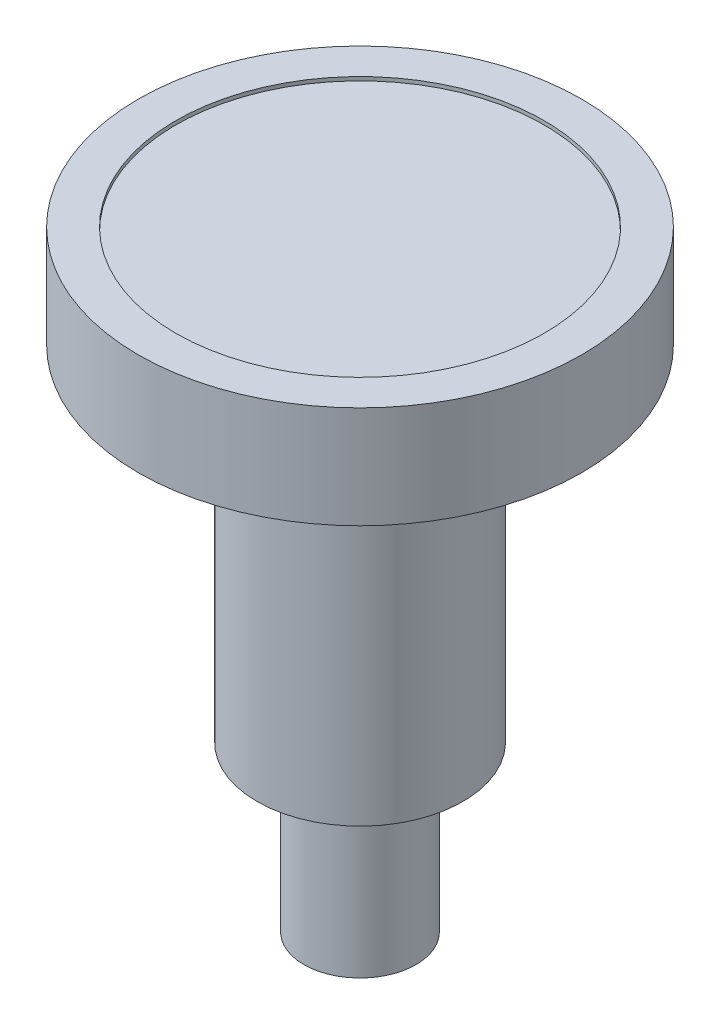
ISO-10303-21;
HEADER;
FILE_DESCRIPTION(('STEP AP214'),'2;1');
FILE_NAME('part.step','',(''),(''),'','','');
FILE_SCHEMA(('AUTOMOTIVE_DESIGN { 1 0 10303 214 1 1 1 1 }'));
ENDSEC;
DATA;
#1=APPLICATION_CONTEXT('core data for automotive mechanical design processes');
#2=APPLICATION_PROTOCOL_DEFINITION('international standard','automotive_design',2000,#1);
#3=PRODUCT_CONTEXT('',#1,'mechanical');
#4=PRODUCT('Part','Part','',(#3));
#5=PRODUCT_RELATED_PRODUCT_CATEGORY('part','',(#4));
#6=PRODUCT_DEFINITION_FORMATION('','',#4);
#7=PRODUCT_DEFINITION_CONTEXT('part definition',#1,'design');
#8=PRODUCT_DEFINITION('design','',#6,#7);
#9=PRODUCT_DEFINITION_SHAPE('','',#8);
#10=(LENGTH_UNIT() NAMED_UNIT(*) SI_UNIT(.MILLI.,.METRE.));
#11=(NAMED_UNIT(*) PLANE_ANGLE_UNIT() SI_UNIT($,.RADIAN.));
#12=(NAMED_UNIT(*) SI_UNIT($,.STERADIAN.) SOLID_ANGLE_UNIT());
#13=UNCERTAINTY_MEASURE_WITH_UNIT(LENGTH_MEASURE(1.E-05),#10,'distance_accuracy_value','');
#14=(GEOMETRIC_REPRESENTATION_CONTEXT(3) GLOBAL_UNCERTAINTY_ASSIGNED_CONTEXT((#13)) GLOBAL_UNIT_ASSIGNED_CONTEXT((#10,
#11,#12)) REPRESENTATION_CONTEXT('',''));
#15=CARTESIAN_POINT('',(0.,0.,0.));
#16=DIRECTION('',(0.,0.,1.));
#17=DIRECTION('',(1.,0.,0.));
#18=AXIS2_PLACEMENT_3D('',#15,#16,#17);
#19=CARTESIAN_POINT('',(0.,4.4,0.));
#20=DIRECTION('',(0.,-1.,0.));
#21=DIRECTION('',(0.,0.,-1.));
#22=AXIS2_PLACEMENT_3D('',#19,#20,#21);
#23=CYLINDRICAL_SURFACE('',#22,1.5);
#24=CARTESIAN_POINT('',(0.,4.4,0.));
#25=DIRECTION('',(0.,1.,0.));
#26=DIRECTION('',(0.,0.,1.));
#27=AXIS2_PLACEMENT_3D('',#24,#25,#26);
#28=CIRCLE('',#27,1.5);
#29=CARTESIAN_POINT('',(0.,4.4,1.5));
#30=VERTEX_POINT('',#29);
#31=EDGE_CURVE('E49',#30,#30,#28,.T.);
#32=ORIENTED_EDGE('',*,*,#31,.F.);
#33=EDGE_LOOP('',(#32));
#34=FACE_BOUND('',#33,.T.);
#35=CARTESIAN_POINT('',(0.,0.,0.));
#36=DIRECTION('',(0.,1.,0.));
#37=DIRECTION('',(0.,0.,1.));
#38=AXIS2_PLACEMENT_3D('',#35,#36,#37);
#39=CIRCLE('',#38,1.5);
#40=CARTESIAN_POINT('',(0.,0.,1.5));
#41=VERTEX_POINT('',#40);
#42=EDGE_CURVE('E53',#41,#41,#39,.T.);
#43=ORIENTED_EDGE('',*,*,#42,.T.);
#44=EDGE_LOOP('',(#43));
#45=FACE_BOUND('',#44,.T.);
#46=ADVANCED_FACE('F39',(#34,#45),#23,.T.);
#47=CARTESIAN_POINT('',(0.,0.,0.));
#48=DIRECTION('',(0.,1.,0.));
#49=DIRECTION('',(0.,0.,1.));
#50=AXIS2_PLACEMENT_3D('',#47,#48,#49);
#51=PLANE('',#50);
#52=ORIENTED_EDGE('',*,*,#42,.F.);
#53=EDGE_LOOP('',(#52));
#54=FACE_BOUND('',#53,.T.);
#55=ADVANCED_FACE('F104',(#54),#51,.F.);
#56=CARTESIAN_POINT('',(0.,13.6,0.));
#57=DIRECTION('',(0.,-1.,0.));
#58=DIRECTION('',(0.,0.,-1.));
#59=AXIS2_PLACEMENT_3D('',#56,#57,#58);
#60=CYLINDRICAL_SURFACE('',#59,2.75);
#61=CARTESIAN_POINT('',(0.,13.1,0.));
#62=DIRECTION('',(0.,1.,0.));
#63=DIRECTION('',(0.,0.,1.));
#64=AXIS2_PLACEMENT_3D('',#61,#62,#63);
#65=CIRCLE('',#64,2.75);
#66=CARTESIAN_POINT('',(0.,13.1,2.75));
#67=VERTEX_POINT('',#66);
#68=EDGE_CURVE('E10',#67,#67,#65,.F.);
#69=ORIENTED_EDGE('',*,*,#68,.T.);
#70=EDGE_LOOP('',(#69));
#71=FACE_BOUND('',#70,.T.);
#72=CARTESIAN_POINT('',(0.,4.4,0.));
#73=DIRECTION('',(0.,1.,0.));
#74=DIRECTION('',(0.,0.,1.));
#75=AXIS2_PLACEMENT_3D('',#72,#73,#74);
#76=CIRCLE('',#75,2.75);
#77=CARTESIAN_POINT('',(0.,4.4,2.75));
#78=VERTEX_POINT('',#77);
#79=EDGE_CURVE('E59',#78,#78,#76,.T.);
#80=ORIENTED_EDGE('',*,*,#79,.T.);
#81=EDGE_LOOP('',(#80));
#82=FACE_BOUND('',#81,.T.);
#83=ADVANCED_FACE('F109',(#71,#82),#60,.T.);
#84=CARTESIAN_POINT('',(0.,4.4,0.));
#85=DIRECTION('',(0.,1.,0.));
#86=DIRECTION('',(0.,0.,1.));
#87=AXIS2_PLACEMENT_3D('',#84,#85,#86);
#88=PLANE('',#87);
#89=ORIENTED_EDGE('',*,*,#31,.T.);
#90=EDGE_LOOP('',(#89));
#91=FACE_BOUND('',#90,.T.);
#92=ORIENTED_EDGE('',*,*,#79,.F.);
#93=EDGE_LOOP('',(#92));
#94=FACE_BOUND('',#93,.T.);
#95=ADVANCED_FACE('F91',(#91,#94),#88,.F.);
#96=CARTESIAN_POINT('',(0.,16.33,0.));
#97=DIRECTION('',(0.,-1.,0.));
#98=DIRECTION('',(0.,0.,-1.));
#99=AXIS2_PLACEMENT_3D('',#96,#97,#98);
#100=CYLINDRICAL_SURFACE('',#99,5.925);
#101=CARTESIAN_POINT('',(0.,16.33,0.));
#102=DIRECTION('',(0.,1.,0.));
#103=DIRECTION('',(0.,0.,1.));
#104=AXIS2_PLACEMENT_3D('',#101,#102,#103);
#105=CIRCLE('',#104,5.925);
#106=CARTESIAN_POINT('',(0.,16.33,-5.925));
#107=VERTEX_POINT('',#106);
#108=EDGE_CURVE('E64',#107,#107,#105,.T.);
#109=CARTESIAN_POINT('',(0.,13.6,0.));
#110=DIRECTION('',(0.,1.,0.));
#111=DIRECTION('',(0.,0.,1.));
#112=AXIS2_PLACEMENT_3D('',#109,#110,#111);
#113=CIRCLE('',#112,5.925);
#114=CARTESIAN_POINT('',(0.,13.6,-5.925));
#115=VERTEX_POINT('',#114);
#116=EDGE_CURVE('E62',#115,#115,#113,.T.);
#117=CARTESIAN_POINT('',(0.,16.33,-5.925));
#118=CARTESIAN_POINT('',(0.,16.3015625,-5.925));
#119=CARTESIAN_POINT('',(0.,16.273125,-5.925));
#120=CARTESIAN_POINT('',(0.,16.21625,-5.925));
#121=CARTESIAN_POINT('',(0.,16.1878125,-5.925));
#122=CARTESIAN_POINT('',(0.,16.1309375,-5.925));
#123=CARTESIAN_POINT('',(0.,16.1025,-5.925));
#124=CARTESIAN_POINT('',(0.,16.045625,-5.925));
#125=CARTESIAN_POINT('',(0.,16.0171875,-5.925));
#126=CARTESIAN_POINT('',(0.,15.9603125,-5.925));
#127=CARTESIAN_POINT('',(0.,15.931875,-5.925));
#128=CARTESIAN_POINT('',(0.,15.875,-5.925));
#129=CARTESIAN_POINT('',(0.,15.8465625,-5.925));
#130=CARTESIAN_POINT('',(0.,15.7896875,-5.925));
#131=CARTESIAN_POINT('',(0.,15.76125,-5.925));
#132=CARTESIAN_POINT('',(0.,15.704375,-5.925));
#133=CARTESIAN_POINT('',(0.,15.6759375,-5.925));
#134=CARTESIAN_POINT('',(0.,15.6190625,-5.925));
#135=CARTESIAN_POINT('',(0.,15.590625,-5.925));
#136=CARTESIAN_POINT('',(0.,15.53375,-5.925));
#137=CARTESIAN_POINT('',(0.,15.5053125,-5.925));
#138=CARTESIAN_POINT('',(0.,15.4484375,-5.925));
#139=CARTESIAN_POINT('',(0.,15.42,-5.925));
#140=CARTESIAN_POINT('',(0.,15.363125,-5.925));
#141=CARTESIAN_POINT('',(0.,15.3346875,-5.925));
#142=CARTESIAN_POINT('',(0.,15.2778125,-5.925));
#143=CARTESIAN_POINT('',(0.,15.249375,-5.925));
#144=CARTESIAN_POINT('',(0.,15.1925,-5.925));
#145=CARTESIAN_POINT('',(0.,15.1640625,-5.925));
#146=CARTESIAN_POINT('',(0.,15.1071875,-5.925));
#147=CARTESIAN_POINT('',(0.,15.07875,-5.925));
#148=CARTESIAN_POINT('',(0.,15.021875,-5.925));
#149=CARTESIAN_POINT('',(0.,14.9934375,-5.925));
#150=CARTESIAN_POINT('',(0.,14.9365625,-5.925));
#151=CARTESIAN_POINT('',(0.,14.908125,-5.925));
#152=CARTESIAN_POINT('',(0.,14.85125,-5.925));
#153=CARTESIAN_POINT('',(0.,14.8228125,-5.925));
#154=CARTESIAN_POINT('',(0.,14.7659375,-5.925));
#155=CARTESIAN_POINT('',(0.,14.7375,-5.925));
#156=CARTESIAN_POINT('',(0.,14.680625,-5.925));
#157=CARTESIAN_POINT('',(0.,14.6521875,-5.925));
#158=CARTESIAN_POINT('',(0.,14.5953125,-5.925));
#159=CARTESIAN_POINT('',(0.,14.566875,-5.925));
#160=CARTESIAN_POINT('',(0.,14.51,-5.925));
#161=CARTESIAN_POINT('',(0.,14.4815625,-5.925));
#162=CARTESIAN_POINT('',(0.,14.4246875,-5.925));
#163=CARTESIAN_POINT('',(0.,14.39625,-5.925));
#164=CARTESIAN_POINT('',(0.,14.339375,-5.925));
#165=CARTESIAN_POINT('',(0.,14.3109375,-5.925));
#166=CARTESIAN_POINT('',(0.,14.2540625,-5.925));
#167=CARTESIAN_POINT('',(0.,14.225625,-5.925));
#168=CARTESIAN_POINT('',(0.,14.16875,-5.925));
#169=CARTESIAN_POINT('',(0.,14.1403125,-5.925));
#170=CARTESIAN_POINT('',(0.,14.0834375,-5.925));
#171=CARTESIAN_POINT('',(0.,14.055,-5.925));
#172=CARTESIAN_POINT('',(0.,13.998125,-5.925));
#173=CARTESIAN_POINT('',(0.,13.9696875,-5.925));
#174=CARTESIAN_POINT('',(0.,13.9128125,-5.925));
#175=CARTESIAN_POINT('',(0.,13.884375,-5.925));
#176=CARTESIAN_POINT('',(0.,13.8275,-5.925));
#177=CARTESIAN_POINT('',(0.,13.7990625,-5.925));
#178=CARTESIAN_POINT('',(0.,13.7421875,-5.925));
#179=CARTESIAN_POINT('',(0.,13.71375,-5.925));
#180=CARTESIAN_POINT('',(0.,13.656875,-5.925));
#181=CARTESIAN_POINT('',(0.,13.6284375,-5.925));
#182=CARTESIAN_POINT('',(0.,13.6,-5.925));
#183=B_SPLINE_CURVE_WITH_KNOTS('',3,(#117,#118,#119,#120,#121,#122,#123,#124,#125,#126,#127,
#128,#129,#130,#131,#132,#133,#134,#135,#136,#137,#138,#139,#140,#141,#142,#143,#144,#145,#146,
#147,#148,#149,#150,#151,#152,#153,#154,#155,#156,#157,#158,#159,#160,#161,#162,#163,#164,#165,
#166,#167,#168,#169,#170,#171,#172,#173,#174,#175,#176,#177,#178,#179,#180,#181,#182),
.UNSPECIFIED.,.F.,.F.,(4,2,2,2,2,2,2,2,2,2,2,2,2,2,2,2,2,2,2,2,2,2,2,2,2,2,2,2,2,2,2,2,4),(0.,
0.0853124999999968,0.170624999999997,0.255937499999997,0.341249999999998,0.426562499999998,
0.511874999999998,0.597187499999999,0.682499999999999,0.767812499999998,0.853124999999998,
0.938437499999998,1.02375,1.1090625,1.194375,1.2796875,1.365,1.4503125,1.535625,1.6209375,
1.70625,1.7915625,1.876875,1.9621875,2.0475,2.1328125,2.218125,2.3034375,2.38875,2.4740625,
2.559375,2.6446875,2.73),.UNSPECIFIED.);
#184=EDGE_CURVE('BSEAM87',#107,#115,#183,.T.);
#185=ORIENTED_EDGE('',*,*,#108,.F.);
#186=ORIENTED_EDGE('',*,*,#116,.T.);
#187=ORIENTED_EDGE('',*,*,#184,.T.);
#188=ORIENTED_EDGE('',*,*,#184,.F.);
#189=EDGE_LOOP('',(#185,#187,#186,#188));
#190=FACE_BOUND('',#189,.T.);
#191=ADVANCED_FACE('F87',(#190),#100,.T.);
#192=CARTESIAN_POINT('',(0.,16.33,0.));
#193=DIRECTION('',(0.,1.,0.));
#194=DIRECTION('',(0.,0.,1.));
#195=AXIS2_PLACEMENT_3D('',#192,#193,#194);
#196=PLANE('',#195);
#197=CARTESIAN_POINT('',(0.,16.33,0.));
#198=DIRECTION('',(0.,1.,0.));
#199=DIRECTION('',(0.,0.,1.));
#200=AXIS2_PLACEMENT_3D('',#197,#198,#199);
#201=CIRCLE('',#200,4.925);
#202=CARTESIAN_POINT('',(0.,16.33,4.925));
#203=VERTEX_POINT('',#202);
#204=EDGE_CURVE('E67',#203,#203,#201,.T.);
#205=ORIENTED_EDGE('',*,*,#204,.F.);
#206=EDGE_LOOP('',(#205));
#207=FACE_BOUND('',#206,.T.);
#208=ORIENTED_EDGE('',*,*,#108,.T.);
#209=EDGE_LOOP('',(#208));
#210=FACE_BOUND('',#209,.T.);
#211=ADVANCED_FACE('F83',(#207,#210),#196,.T.);
#212=CARTESIAN_POINT('',(0.,13.6,0.));
#213=DIRECTION('',(0.,1.,0.));
#214=DIRECTION('',(0.,0.,1.));
#215=AXIS2_PLACEMENT_3D('',#212,#213,#214);
#216=PLANE('',#215);
#217=CARTESIAN_POINT('',(0.,13.6,0.));
#218=DIRECTION('',(0.,1.,0.));
#219=DIRECTION('',(0.,0.,1.));
#220=AXIS2_PLACEMENT_3D('',#217,#218,#219);
#221=CIRCLE('',#220,3.25);
#222=CARTESIAN_POINT('',(0.,13.6,3.25));
#223=VERTEX_POINT('',#222);
#224=EDGE_CURVE('E46',#223,#223,#221,.T.);
#225=ORIENTED_EDGE('',*,*,#224,.T.);
#226=EDGE_LOOP('',(#225));
#227=FACE_BOUND('',#226,.T.);
#228=ORIENTED_EDGE('',*,*,#116,.F.);
#229=EDGE_LOOP('',(#228));
#230=FACE_BOUND('',#229,.T.);
#231=ADVANCED_FACE('F88',(#227,#230),#216,.F.);
#232=CARTESIAN_POINT('',(0.,13.1,0.));
#233=DIRECTION('',(0.,1.,0.));
#234=DIRECTION('',(0.,0.,1.));
#235=AXIS2_PLACEMENT_3D('',#232,#233,#234);
#236=TOROIDAL_SURFACE('',#235,3.25,0.5);
#237=ORIENTED_EDGE('',*,*,#68,.F.);
#238=EDGE_LOOP('',(#237));
#239=FACE_BOUND('',#238,.T.);
#240=ORIENTED_EDGE('',*,*,#224,.F.);
#241=EDGE_LOOP('',(#240));
#242=FACE_BOUND('',#241,.T.);
#243=ADVANCED_FACE('F41',(#239,#242),#236,.F.);
#244=CARTESIAN_POINT('',(0.,16.23,0.));
#245=DIRECTION('',(0.,1.,0.));
#246=DIRECTION('',(0.,0.,1.));
#247=AXIS2_PLACEMENT_3D('',#244,#245,#246);
#248=CYLINDRICAL_SURFACE('',#247,4.925);
#249=CARTESIAN_POINT('',(0.,16.23,0.));
#250=DIRECTION('',(0.,1.,0.));
#251=DIRECTION('',(0.,0.,1.));
#252=AXIS2_PLACEMENT_3D('',#249,#250,#251);
#253=CIRCLE('',#252,4.925);
#254=CARTESIAN_POINT('',(0.,16.23,4.925));
#255=VERTEX_POINT('',#254);
#256=EDGE_CURVE('E66',#255,#255,#253,.T.);
#257=ORIENTED_EDGE('',*,*,#256,.F.);
#258=EDGE_LOOP('',(#257));
#259=FACE_BOUND('',#258,.T.);
#260=ORIENTED_EDGE('',*,*,#204,.T.);
#261=EDGE_LOOP('',(#260));
#262=FACE_BOUND('',#261,.T.);
#263=ADVANCED_FACE('F79',(#259,#262),#248,.F.);
#264=CARTESIAN_POINT('',(0.,16.23,0.));
#265=DIRECTION('',(0.,1.,0.));
#266=DIRECTION('',(0.,0.,1.));
#267=AXIS2_PLACEMENT_3D('',#264,#265,#266);
#268=PLANE('',#267);
#269=ORIENTED_EDGE('',*,*,#256,.T.);
#270=EDGE_LOOP('',(#269));
#271=FACE_BOUND('',#270,.T.);
#272=ADVANCED_FACE('F73',(#271),#268,.T.);
#273=CLOSED_SHELL('',(#46,#55,#83,#95,#191,#211,#231,#243,#263,#272));
#274=MANIFOLD_SOLID_BREP('B2',#273);
#275=ADVANCED_BREP_SHAPE_REPRESENTATION('',(#18,#274),#14);
#276=SHAPE_DEFINITION_REPRESENTATION(#9,#275);
ENDSEC;
END-ISO-10303-21;
